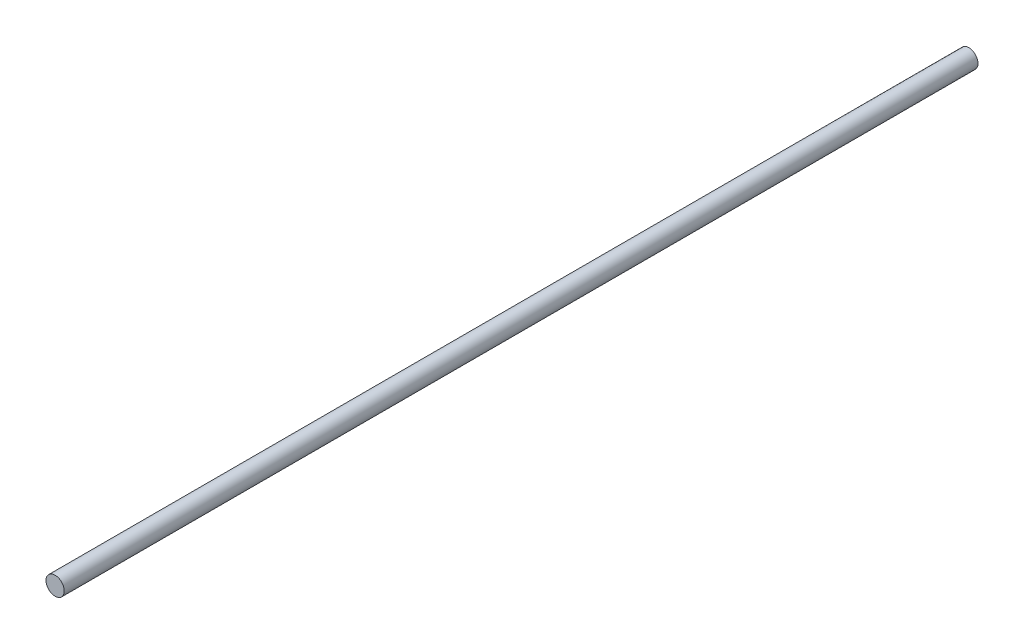
ISO-10303-21;
HEADER;
FILE_DESCRIPTION(('STEP AP214'),'2;1');
FILE_NAME('part.step','',(''),(''),'','','');
FILE_SCHEMA(('AUTOMOTIVE_DESIGN { 1 0 10303 214 1 1 1 1 }'));
ENDSEC;
DATA;
#1=APPLICATION_CONTEXT('core data for automotive mechanical design processes');
#2=APPLICATION_PROTOCOL_DEFINITION('international standard','automotive_design',2000,#1);
#3=PRODUCT_CONTEXT('',#1,'mechanical');
#4=PRODUCT('Part','Part','',(#3));
#5=PRODUCT_RELATED_PRODUCT_CATEGORY('part','',(#4));
#6=PRODUCT_DEFINITION_FORMATION('','',#4);
#7=PRODUCT_DEFINITION_CONTEXT('part definition',#1,'design');
#8=PRODUCT_DEFINITION('design','',#6,#7);
#9=PRODUCT_DEFINITION_SHAPE('','',#8);
#10=(LENGTH_UNIT() NAMED_UNIT(*) SI_UNIT(.MILLI.,.METRE.));
#11=(NAMED_UNIT(*) PLANE_ANGLE_UNIT() SI_UNIT($,.RADIAN.));
#12=(NAMED_UNIT(*) SI_UNIT($,.STERADIAN.) SOLID_ANGLE_UNIT());
#13=UNCERTAINTY_MEASURE_WITH_UNIT(LENGTH_MEASURE(1.E-05),#10,'distance_accuracy_value','');
#14=(GEOMETRIC_REPRESENTATION_CONTEXT(3) GLOBAL_UNCERTAINTY_ASSIGNED_CONTEXT((#13)) GLOBAL_UNIT_ASSIGNED_CONTEXT((#10,
#11,#12)) REPRESENTATION_CONTEXT('',''));
#15=CARTESIAN_POINT('',(0.,0.,0.));
#16=DIRECTION('',(0.,0.,1.));
#17=DIRECTION('',(1.,0.,0.));
#18=AXIS2_PLACEMENT_3D('',#15,#16,#17);
#19=CARTESIAN_POINT('',(0.,0.,400.));
#20=DIRECTION('',(0.,0.,-1.));
#21=DIRECTION('',(-1.,0.,0.));
#22=AXIS2_PLACEMENT_3D('',#19,#20,#21);
#23=CYLINDRICAL_SURFACE('',#22,4.);
#24=CARTESIAN_POINT('',(0.,0.,400.));
#25=DIRECTION('',(0.,0.,1.));
#26=DIRECTION('',(1.,0.,0.));
#27=AXIS2_PLACEMENT_3D('',#24,#25,#26);
#28=CIRCLE('',#27,4.);
#29=CARTESIAN_POINT('',(4.,0.,400.));
#30=VERTEX_POINT('',#29);
#31=EDGE_CURVE('E10',#30,#30,#28,.T.);
#32=ORIENTED_EDGE('',*,*,#31,.F.);
#33=EDGE_LOOP('',(#32));
#34=FACE_BOUND('',#33,.T.);
#35=CARTESIAN_POINT('',(0.,0.,0.));
#36=DIRECTION('',(0.,0.,1.));
#37=DIRECTION('',(1.,0.,0.));
#38=AXIS2_PLACEMENT_3D('',#35,#36,#37);
#39=CIRCLE('',#38,4.);
#40=CARTESIAN_POINT('',(4.,0.,0.));
#41=VERTEX_POINT('',#40);
#42=EDGE_CURVE('E35',#41,#41,#39,.T.);
#43=ORIENTED_EDGE('',*,*,#42,.T.);
#44=EDGE_LOOP('',(#43));
#45=FACE_BOUND('',#44,.T.);
#46=ADVANCED_FACE('F32',(#34,#45),#23,.T.);
#47=CARTESIAN_POINT('',(0.,0.,400.));
#48=DIRECTION('',(0.,0.,1.));
#49=DIRECTION('',(1.,0.,0.));
#50=AXIS2_PLACEMENT_3D('',#47,#48,#49);
#51=PLANE('',#50);
#52=ORIENTED_EDGE('',*,*,#31,.T.);
#53=EDGE_LOOP('',(#52));
#54=FACE_BOUND('',#53,.T.);
#55=ADVANCED_FACE('F47',(#54),#51,.T.);
#56=CARTESIAN_POINT('',(0.,0.,0.));
#57=DIRECTION('',(0.,0.,1.));
#58=DIRECTION('',(1.,0.,0.));
#59=AXIS2_PLACEMENT_3D('',#56,#57,#58);
#60=PLANE('',#59);
#61=ORIENTED_EDGE('',*,*,#42,.F.);
#62=EDGE_LOOP('',(#61));
#63=FACE_BOUND('',#62,.T.);
#64=ADVANCED_FACE('F45',(#63),#60,.F.);
#65=CLOSED_SHELL('',(#46,#55,#64));
#66=MANIFOLD_SOLID_BREP('B2',#65);
#67=ADVANCED_BREP_SHAPE_REPRESENTATION('',(#18,#66),#14);
#68=SHAPE_DEFINITION_REPRESENTATION(#9,#67);
ENDSEC;
END-ISO-10303-21;
